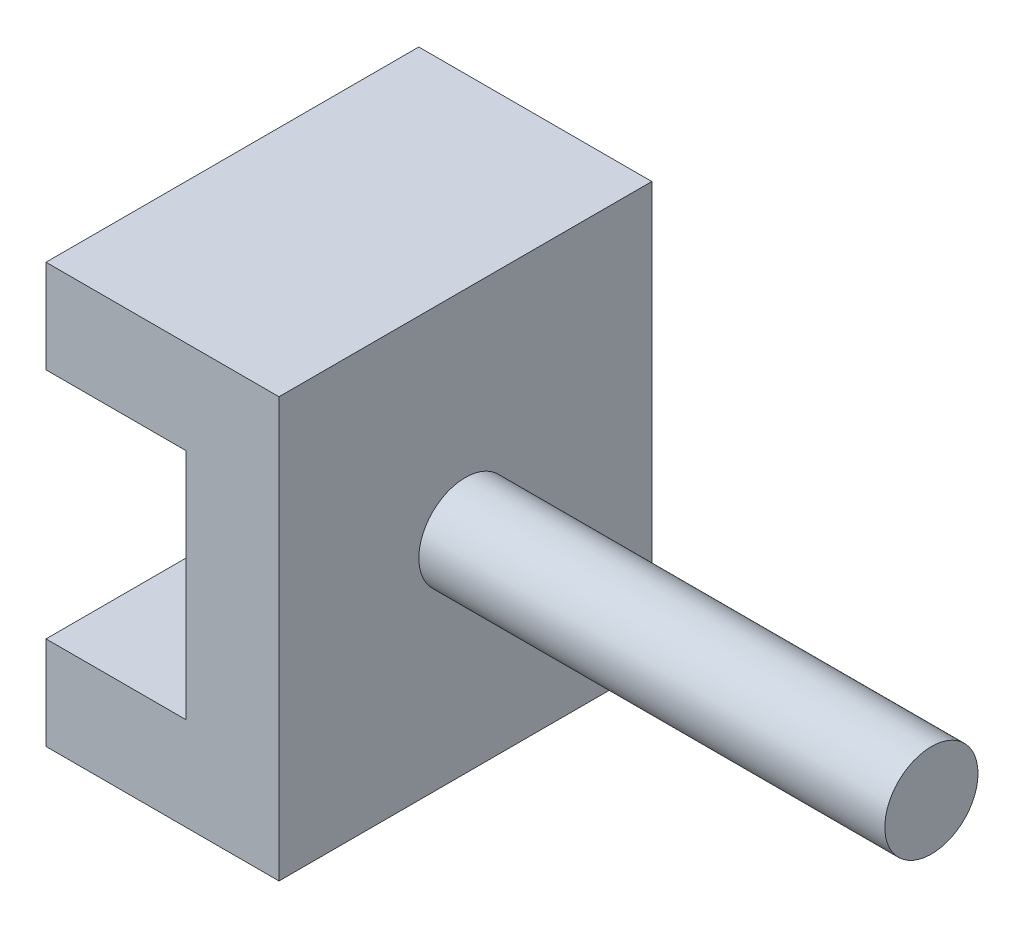
ISO-10303-21;
HEADER;
FILE_DESCRIPTION(('STEP AP214'),'2;1');
FILE_NAME('part.step','',(''),(''),'','','');
FILE_SCHEMA(('AUTOMOTIVE_DESIGN { 1 0 10303 214 1 1 1 1 }'));
ENDSEC;
DATA;
#1=APPLICATION_CONTEXT('core data for automotive mechanical design processes');
#2=APPLICATION_PROTOCOL_DEFINITION('international standard','automotive_design',2000,#1);
#3=PRODUCT_CONTEXT('',#1,'mechanical');
#4=PRODUCT('Part','Part','',(#3));
#5=PRODUCT_RELATED_PRODUCT_CATEGORY('part','',(#4));
#6=PRODUCT_DEFINITION_FORMATION('','',#4);
#7=PRODUCT_DEFINITION_CONTEXT('part definition',#1,'design');
#8=PRODUCT_DEFINITION('design','',#6,#7);
#9=PRODUCT_DEFINITION_SHAPE('','',#8);
#10=(LENGTH_UNIT() NAMED_UNIT(*) SI_UNIT(.MILLI.,.METRE.));
#11=(NAMED_UNIT(*) PLANE_ANGLE_UNIT() SI_UNIT($,.RADIAN.));
#12=(NAMED_UNIT(*) SI_UNIT($,.STERADIAN.) SOLID_ANGLE_UNIT());
#13=UNCERTAINTY_MEASURE_WITH_UNIT(LENGTH_MEASURE(1.E-05),#10,'distance_accuracy_value','');
#14=(GEOMETRIC_REPRESENTATION_CONTEXT(3) GLOBAL_UNCERTAINTY_ASSIGNED_CONTEXT((#13)) GLOBAL_UNIT_ASSIGNED_CONTEXT((#10,
#11,#12)) REPRESENTATION_CONTEXT('',''));
#15=CARTESIAN_POINT('',(0.,0.,0.));
#16=DIRECTION('',(0.,0.,1.));
#17=DIRECTION('',(1.,0.,0.));
#18=AXIS2_PLACEMENT_3D('',#15,#16,#17);
#19=CARTESIAN_POINT('',(0.,35.,40.));
#20=DIRECTION('',(-1.,0.,0.));
#21=DIRECTION('',(0.,0.,1.));
#22=AXIS2_PLACEMENT_3D('',#19,#20,#21);
#23=PLANE('',#22);
#24=CARTESIAN_POINT('',(0.,22.5,20.));
#25=DIRECTION('',(1.,0.,0.));
#26=DIRECTION('',(0.,0.,-1.));
#27=AXIS2_PLACEMENT_3D('',#24,#25,#26);
#28=CIRCLE('',#27,5.);
#29=CARTESIAN_POINT('',(0.,22.5,15.));
#30=VERTEX_POINT('',#29);
#31=EDGE_CURVE('E11',#30,#30,#28,.T.);
#32=ORIENTED_EDGE('',*,*,#31,.F.);
#33=EDGE_LOOP('',(#32));
#34=FACE_BOUND('',#33,.T.);
#35=DIRECTION('',(0.,1.,0.));
#36=VECTOR('',#35,1.);
#37=CARTESIAN_POINT('',(0.,35.,0.));
#38=LINE('',#37,#36);
#39=CARTESIAN_POINT('',(0.,0.,0.));
#40=VERTEX_POINT('',#39);
#41=CARTESIAN_POINT('',(0.,45.,0.));
#42=VERTEX_POINT('',#41);
#43=EDGE_CURVE('E92',#40,#42,#38,.T.);
#44=ORIENTED_EDGE('',*,*,#43,.T.);
#45=DIRECTION('',(0.,0.,-1.));
#46=VECTOR('',#45,1.);
#47=CARTESIAN_POINT('',(0.,45.,40.));
#48=LINE('',#47,#46);
#49=CARTESIAN_POINT('',(0.,45.,40.));
#50=VERTEX_POINT('',#49);
#51=EDGE_CURVE('E42',#50,#42,#48,.T.);
#52=ORIENTED_EDGE('',*,*,#51,.F.);
#53=DIRECTION('',(0.,1.,0.));
#54=VECTOR('',#53,1.);
#55=CARTESIAN_POINT('',(0.,0.,40.));
#56=LINE('',#55,#54);
#57=CARTESIAN_POINT('',(0.,0.,40.));
#58=VERTEX_POINT('',#57);
#59=EDGE_CURVE('E98',#58,#50,#56,.T.);
#60=ORIENTED_EDGE('',*,*,#59,.F.);
#61=DIRECTION('',(0.,0.,-1.));
#62=VECTOR('',#61,1.);
#63=CARTESIAN_POINT('',(0.,0.,40.));
#64=LINE('',#63,#62);
#65=EDGE_CURVE('E132',#58,#40,#64,.T.);
#66=ORIENTED_EDGE('',*,*,#65,.T.);
#67=EDGE_LOOP('',(#44,#52,#60,#66));
#68=FACE_BOUND('',#67,.T.);
#69=ADVANCED_FACE('F39',(#34,#68),#23,.F.);
#70=CARTESIAN_POINT('',(0.,45.,40.));
#71=DIRECTION('',(0.,-1.,0.));
#72=DIRECTION('',(0.,0.,-1.));
#73=AXIS2_PLACEMENT_3D('',#70,#71,#72);
#74=PLANE('',#73);
#75=DIRECTION('',(-1.,0.,0.));
#76=VECTOR('',#75,1.);
#77=CARTESIAN_POINT('',(0.,45.,0.));
#78=LINE('',#77,#76);
#79=CARTESIAN_POINT('',(-25.,45.,0.));
#80=VERTEX_POINT('',#79);
#81=EDGE_CURVE('E137',#42,#80,#78,.T.);
#82=ORIENTED_EDGE('',*,*,#81,.T.);
#83=DIRECTION('',(0.,0.,-1.));
#84=VECTOR('',#83,1.);
#85=CARTESIAN_POINT('',(-25.,45.,40.));
#86=LINE('',#85,#84);
#87=CARTESIAN_POINT('',(-25.,45.,40.));
#88=VERTEX_POINT('',#87);
#89=EDGE_CURVE('E159',#88,#80,#86,.T.);
#90=ORIENTED_EDGE('',*,*,#89,.F.);
#91=DIRECTION('',(-1.,0.,0.));
#92=VECTOR('',#91,1.);
#93=CARTESIAN_POINT('',(0.,45.,40.));
#94=LINE('',#93,#92);
#95=EDGE_CURVE('E169',#50,#88,#94,.T.);
#96=ORIENTED_EDGE('',*,*,#95,.F.);
#97=ORIENTED_EDGE('',*,*,#51,.T.);
#98=EDGE_LOOP('',(#82,#90,#96,#97));
#99=FACE_BOUND('',#98,.T.);
#100=ADVANCED_FACE('F168',(#99),#74,.F.);
#101=CARTESIAN_POINT('',(-25.,35.,40.));
#102=DIRECTION('',(1.,0.,0.));
#103=DIRECTION('',(0.,0.,-1.));
#104=AXIS2_PLACEMENT_3D('',#101,#102,#103);
#105=PLANE('',#104);
#106=DIRECTION('',(0.,-1.,0.));
#107=VECTOR('',#106,1.);
#108=CARTESIAN_POINT('',(-25.,35.,0.));
#109=LINE('',#108,#107);
#110=CARTESIAN_POINT('',(-25.,35.,0.));
#111=VERTEX_POINT('',#110);
#112=EDGE_CURVE('E140',#80,#111,#109,.T.);
#113=ORIENTED_EDGE('',*,*,#112,.T.);
#114=DIRECTION('',(0.,0.,-1.));
#115=VECTOR('',#114,1.);
#116=CARTESIAN_POINT('',(-25.,35.,40.));
#117=LINE('',#116,#115);
#118=CARTESIAN_POINT('',(-25.,35.,40.));
#119=VERTEX_POINT('',#118);
#120=EDGE_CURVE('E157',#119,#111,#117,.T.);
#121=ORIENTED_EDGE('',*,*,#120,.F.);
#122=DIRECTION('',(0.,-1.,0.));
#123=VECTOR('',#122,1.);
#124=CARTESIAN_POINT('',(-25.,35.,40.));
#125=LINE('',#124,#123);
#126=EDGE_CURVE('E181',#88,#119,#125,.T.);
#127=ORIENTED_EDGE('',*,*,#126,.F.);
#128=ORIENTED_EDGE('',*,*,#89,.T.);
#129=EDGE_LOOP('',(#113,#121,#127,#128));
#130=FACE_BOUND('',#129,.T.);
#131=ADVANCED_FACE('F175',(#130),#105,.F.);
#132=CARTESIAN_POINT('',(-10.,35.,40.));
#133=DIRECTION('',(0.,1.,0.));
#134=DIRECTION('',(0.,0.,1.));
#135=AXIS2_PLACEMENT_3D('',#132,#133,#134);
#136=PLANE('',#135);
#137=DIRECTION('',(1.,0.,0.));
#138=VECTOR('',#137,1.);
#139=CARTESIAN_POINT('',(-10.,35.,0.));
#140=LINE('',#139,#138);
#141=CARTESIAN_POINT('',(-10.,35.,0.));
#142=VERTEX_POINT('',#141);
#143=EDGE_CURVE('E142',#111,#142,#140,.T.);
#144=ORIENTED_EDGE('',*,*,#143,.T.);
#145=DIRECTION('',(0.,0.,-1.));
#146=VECTOR('',#145,1.);
#147=CARTESIAN_POINT('',(-10.,35.,40.));
#148=LINE('',#147,#146);
#149=CARTESIAN_POINT('',(-10.,35.,40.));
#150=VERTEX_POINT('',#149);
#151=EDGE_CURVE('E154',#150,#142,#148,.T.);
#152=ORIENTED_EDGE('',*,*,#151,.F.);
#153=DIRECTION('',(1.,0.,0.));
#154=VECTOR('',#153,1.);
#155=CARTESIAN_POINT('',(-10.,35.,40.));
#156=LINE('',#155,#154);
#157=EDGE_CURVE('E180',#119,#150,#156,.T.);
#158=ORIENTED_EDGE('',*,*,#157,.F.);
#159=ORIENTED_EDGE('',*,*,#120,.T.);
#160=EDGE_LOOP('',(#144,#152,#158,#159));
#161=FACE_BOUND('',#160,.T.);
#162=ADVANCED_FACE('F178',(#161),#136,.F.);
#163=CARTESIAN_POINT('',(-10.,35.,40.));
#164=DIRECTION('',(1.,0.,0.));
#165=DIRECTION('',(0.,1.,0.));
#166=AXIS2_PLACEMENT_3D('',#163,#164,#165);
#167=PLANE('',#166);
#168=DIRECTION('',(0.,-1.,0.));
#169=VECTOR('',#168,1.);
#170=CARTESIAN_POINT('',(-10.,35.,0.));
#171=LINE('',#170,#169);
#172=CARTESIAN_POINT('',(-10.,10.,0.));
#173=VERTEX_POINT('',#172);
#174=EDGE_CURVE('E144',#142,#173,#171,.T.);
#175=ORIENTED_EDGE('',*,*,#174,.T.);
#176=DIRECTION('',(0.,0.,-1.));
#177=VECTOR('',#176,1.);
#178=CARTESIAN_POINT('',(-10.,10.,40.));
#179=LINE('',#178,#177);
#180=CARTESIAN_POINT('',(-10.,10.,40.));
#181=VERTEX_POINT('',#180);
#182=EDGE_CURVE('E127',#181,#173,#179,.T.);
#183=ORIENTED_EDGE('',*,*,#182,.F.);
#184=DIRECTION('',(0.,-1.,0.));
#185=VECTOR('',#184,1.);
#186=CARTESIAN_POINT('',(-10.,35.,40.));
#187=LINE('',#186,#185);
#188=EDGE_CURVE('E118',#150,#181,#187,.T.);
#189=ORIENTED_EDGE('',*,*,#188,.F.);
#190=ORIENTED_EDGE('',*,*,#151,.T.);
#191=EDGE_LOOP('',(#175,#183,#189,#190));
#192=FACE_BOUND('',#191,.T.);
#193=ADVANCED_FACE('F202',(#192),#167,.F.);
#194=CARTESIAN_POINT('',(-10.,10.,40.));
#195=DIRECTION('',(0.,-1.,0.));
#196=DIRECTION('',(1.,0.,0.));
#197=AXIS2_PLACEMENT_3D('',#194,#195,#196);
#198=PLANE('',#197);
#199=DIRECTION('',(-1.,0.,0.));
#200=VECTOR('',#199,1.);
#201=CARTESIAN_POINT('',(-10.,10.,0.));
#202=LINE('',#201,#200);
#203=CARTESIAN_POINT('',(-25.,10.,0.));
#204=VERTEX_POINT('',#203);
#205=EDGE_CURVE('E126',#173,#204,#202,.T.);
#206=ORIENTED_EDGE('',*,*,#205,.T.);
#207=DIRECTION('',(0.,0.,-1.));
#208=VECTOR('',#207,1.);
#209=CARTESIAN_POINT('',(-25.,10.,40.));
#210=LINE('',#209,#208);
#211=CARTESIAN_POINT('',(-25.,10.,40.));
#212=VERTEX_POINT('',#211);
#213=EDGE_CURVE('E123',#212,#204,#210,.T.);
#214=ORIENTED_EDGE('',*,*,#213,.F.);
#215=DIRECTION('',(-1.,0.,0.));
#216=VECTOR('',#215,1.);
#217=CARTESIAN_POINT('',(-10.,10.,40.));
#218=LINE('',#217,#216);
#219=EDGE_CURVE('E112',#181,#212,#218,.T.);
#220=ORIENTED_EDGE('',*,*,#219,.F.);
#221=ORIENTED_EDGE('',*,*,#182,.T.);
#222=EDGE_LOOP('',(#206,#214,#220,#221));
#223=FACE_BOUND('',#222,.T.);
#224=ADVANCED_FACE('F124',(#223),#198,.F.);
#225=CARTESIAN_POINT('',(-25.,0.,40.));
#226=DIRECTION('',(1.,0.,0.));
#227=DIRECTION('',(0.,0.,-1.));
#228=AXIS2_PLACEMENT_3D('',#225,#226,#227);
#229=PLANE('',#228);
#230=DIRECTION('',(0.,-1.,0.));
#231=VECTOR('',#230,1.);
#232=CARTESIAN_POINT('',(-25.,0.,0.));
#233=LINE('',#232,#231);
#234=CARTESIAN_POINT('',(-25.,0.,0.));
#235=VERTEX_POINT('',#234);
#236=EDGE_CURVE('E85',#204,#235,#233,.T.);
#237=ORIENTED_EDGE('',*,*,#236,.T.);
#238=DIRECTION('',(0.,0.,-1.));
#239=VECTOR('',#238,1.);
#240=CARTESIAN_POINT('',(-25.,0.,40.));
#241=LINE('',#240,#239);
#242=CARTESIAN_POINT('',(-25.,0.,40.));
#243=VERTEX_POINT('',#242);
#244=EDGE_CURVE('E128',#243,#235,#241,.T.);
#245=ORIENTED_EDGE('',*,*,#244,.F.);
#246=DIRECTION('',(0.,-1.,0.));
#247=VECTOR('',#246,1.);
#248=CARTESIAN_POINT('',(-25.,0.,40.));
#249=LINE('',#248,#247);
#250=EDGE_CURVE('E116',#212,#243,#249,.T.);
#251=ORIENTED_EDGE('',*,*,#250,.F.);
#252=ORIENTED_EDGE('',*,*,#213,.T.);
#253=EDGE_LOOP('',(#237,#245,#251,#252));
#254=FACE_BOUND('',#253,.T.);
#255=ADVANCED_FACE('F130',(#254),#229,.F.);
#256=CARTESIAN_POINT('',(0.,0.,40.));
#257=DIRECTION('',(0.,1.,0.));
#258=DIRECTION('',(-1.,0.,0.));
#259=AXIS2_PLACEMENT_3D('',#256,#257,#258);
#260=PLANE('',#259);
#261=DIRECTION('',(1.,0.,0.));
#262=VECTOR('',#261,1.);
#263=CARTESIAN_POINT('',(0.,0.,0.));
#264=LINE('',#263,#262);
#265=EDGE_CURVE('E148',#235,#40,#264,.T.);
#266=ORIENTED_EDGE('',*,*,#265,.T.);
#267=ORIENTED_EDGE('',*,*,#65,.F.);
#268=DIRECTION('',(1.,0.,0.));
#269=VECTOR('',#268,1.);
#270=CARTESIAN_POINT('',(0.,0.,40.));
#271=LINE('',#270,#269);
#272=EDGE_CURVE('E56',#243,#58,#271,.T.);
#273=ORIENTED_EDGE('',*,*,#272,.F.);
#274=ORIENTED_EDGE('',*,*,#244,.T.);
#275=EDGE_LOOP('',(#266,#267,#273,#274));
#276=FACE_BOUND('',#275,.T.);
#277=ADVANCED_FACE('F200',(#276),#260,.F.);
#278=CARTESIAN_POINT('',(0.,0.,40.));
#279=DIRECTION('',(0.,0.,1.));
#280=DIRECTION('',(1.,0.,0.));
#281=AXIS2_PLACEMENT_3D('',#278,#279,#280);
#282=PLANE('',#281);
#283=ORIENTED_EDGE('',*,*,#59,.T.);
#284=ORIENTED_EDGE('',*,*,#95,.T.);
#285=ORIENTED_EDGE('',*,*,#126,.T.);
#286=ORIENTED_EDGE('',*,*,#157,.T.);
#287=ORIENTED_EDGE('',*,*,#188,.T.);
#288=ORIENTED_EDGE('',*,*,#219,.T.);
#289=ORIENTED_EDGE('',*,*,#250,.T.);
#290=ORIENTED_EDGE('',*,*,#272,.T.);
#291=EDGE_LOOP('',(#283,#284,#285,#286,#287,#288,#289,#290));
#292=FACE_BOUND('',#291,.T.);
#293=ADVANCED_FACE('F114',(#292),#282,.T.);
#294=CARTESIAN_POINT('',(0.,0.,0.));
#295=DIRECTION('',(0.,0.,1.));
#296=DIRECTION('',(1.,0.,0.));
#297=AXIS2_PLACEMENT_3D('',#294,#295,#296);
#298=PLANE('',#297);
#299=ORIENTED_EDGE('',*,*,#43,.F.);
#300=ORIENTED_EDGE('',*,*,#265,.F.);
#301=ORIENTED_EDGE('',*,*,#236,.F.);
#302=ORIENTED_EDGE('',*,*,#205,.F.);
#303=ORIENTED_EDGE('',*,*,#174,.F.);
#304=ORIENTED_EDGE('',*,*,#143,.F.);
#305=ORIENTED_EDGE('',*,*,#112,.F.);
#306=ORIENTED_EDGE('',*,*,#81,.F.);
#307=EDGE_LOOP('',(#299,#300,#301,#302,#303,#304,#305,#306));
#308=FACE_BOUND('',#307,.T.);
#309=ADVANCED_FACE('F171',(#308),#298,.F.);
#310=CARTESIAN_POINT('',(50.,22.5,20.));
#311=DIRECTION('',(-1.,0.,0.));
#312=DIRECTION('',(0.,0.,1.));
#313=AXIS2_PLACEMENT_3D('',#310,#311,#312);
#314=CYLINDRICAL_SURFACE('',#313,5.);
#315=CARTESIAN_POINT('',(50.,22.5,20.));
#316=DIRECTION('',(1.,0.,0.));
#317=DIRECTION('',(0.,0.,-1.));
#318=AXIS2_PLACEMENT_3D('',#315,#316,#317);
#319=CIRCLE('',#318,5.);
#320=CARTESIAN_POINT('',(50.,22.5,15.));
#321=VERTEX_POINT('',#320);
#322=EDGE_CURVE('E138',#321,#321,#319,.T.);
#323=ORIENTED_EDGE('',*,*,#322,.F.);
#324=EDGE_LOOP('',(#323));
#325=FACE_BOUND('',#324,.T.);
#326=ORIENTED_EDGE('',*,*,#31,.T.);
#327=EDGE_LOOP('',(#326));
#328=FACE_BOUND('',#327,.T.);
#329=ADVANCED_FACE('F192',(#325,#328),#314,.T.);
#330=CARTESIAN_POINT('',(50.,0.,0.));
#331=DIRECTION('',(1.,0.,0.));
#332=DIRECTION('',(0.,0.,-1.));
#333=AXIS2_PLACEMENT_3D('',#330,#331,#332);
#334=PLANE('',#333);
#335=ORIENTED_EDGE('',*,*,#322,.T.);
#336=EDGE_LOOP('',(#335));
#337=FACE_BOUND('',#336,.T.);
#338=ADVANCED_FACE('F190',(#337),#334,.T.);
#339=CLOSED_SHELL('',(#69,#100,#131,#162,#193,#224,#255,#277,#293,#309,#329,#338));
#340=MANIFOLD_SOLID_BREP('B2',#339);
#341=ADVANCED_BREP_SHAPE_REPRESENTATION('',(#18,#340),#14);
#342=SHAPE_DEFINITION_REPRESENTATION(#9,#341);
ENDSEC;
END-ISO-10303-21;
